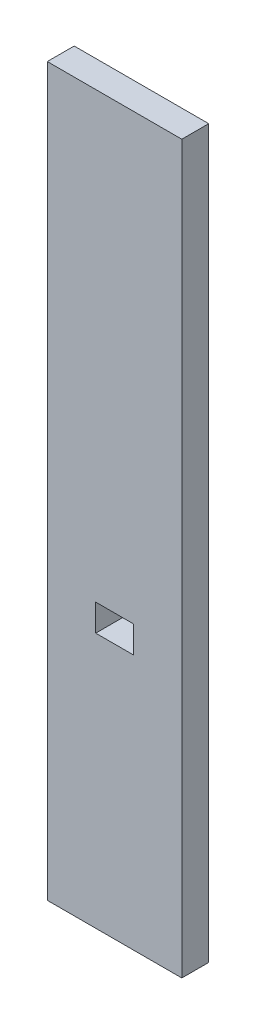
ISO-10303-21;
HEADER;
FILE_DESCRIPTION(('STEP AP214'),'2;1');
FILE_NAME('part.step','',(''),(''),'','','');
FILE_SCHEMA(('AUTOMOTIVE_DESIGN { 1 0 10303 214 1 1 1 1 }'));
ENDSEC;
DATA;
#1=APPLICATION_CONTEXT('core data for automotive mechanical design processes');
#2=APPLICATION_PROTOCOL_DEFINITION('international standard','automotive_design',2000,#1);
#3=PRODUCT_CONTEXT('',#1,'mechanical');
#4=PRODUCT('Part','Part','',(#3));
#5=PRODUCT_RELATED_PRODUCT_CATEGORY('part','',(#4));
#6=PRODUCT_DEFINITION_FORMATION('','',#4);
#7=PRODUCT_DEFINITION_CONTEXT('part definition',#1,'design');
#8=PRODUCT_DEFINITION('design','',#6,#7);
#9=PRODUCT_DEFINITION_SHAPE('','',#8);
#10=(LENGTH_UNIT() NAMED_UNIT(*) SI_UNIT(.MILLI.,.METRE.));
#11=(NAMED_UNIT(*) PLANE_ANGLE_UNIT() SI_UNIT($,.RADIAN.));
#12=(NAMED_UNIT(*) SI_UNIT($,.STERADIAN.) SOLID_ANGLE_UNIT());
#13=UNCERTAINTY_MEASURE_WITH_UNIT(LENGTH_MEASURE(1.E-05),#10,'distance_accuracy_value','');
#14=(GEOMETRIC_REPRESENTATION_CONTEXT(3) GLOBAL_UNCERTAINTY_ASSIGNED_CONTEXT((#13)) GLOBAL_UNIT_ASSIGNED_CONTEXT((#10,
#11,#12)) REPRESENTATION_CONTEXT('',''));
#15=CARTESIAN_POINT('',(0.,0.,0.));
#16=DIRECTION('',(0.,0.,1.));
#17=DIRECTION('',(1.,0.,0.));
#18=AXIS2_PLACEMENT_3D('',#15,#16,#17);
#19=CARTESIAN_POINT('',(-25.,135.,10.));
#20=DIRECTION('',(1.,0.,0.));
#21=DIRECTION('',(0.,1.,0.));
#22=AXIS2_PLACEMENT_3D('',#19,#20,#21);
#23=PLANE('',#22);
#24=DIRECTION('',(0.,-1.,0.));
#25=VECTOR('',#24,1.);
#26=CARTESIAN_POINT('',(-25.,135.,0.));
#27=LINE('',#26,#25);
#28=CARTESIAN_POINT('',(-25.,135.,0.));
#29=VERTEX_POINT('',#28);
#30=CARTESIAN_POINT('',(-25.,-135.,0.));
#31=VERTEX_POINT('',#30);
#32=EDGE_CURVE('E130',#29,#31,#27,.T.);
#33=ORIENTED_EDGE('',*,*,#32,.T.);
#34=DIRECTION('',(0.,0.,-1.));
#35=VECTOR('',#34,1.);
#36=CARTESIAN_POINT('',(-25.,-135.,10.));
#37=LINE('',#36,#35);
#38=CARTESIAN_POINT('',(-25.,-135.,10.));
#39=VERTEX_POINT('',#38);
#40=EDGE_CURVE('E11',#39,#31,#37,.T.);
#41=ORIENTED_EDGE('',*,*,#40,.F.);
#42=DIRECTION('',(0.,-1.,0.));
#43=VECTOR('',#42,1.);
#44=CARTESIAN_POINT('',(-25.,135.,10.));
#45=LINE('',#44,#43);
#46=CARTESIAN_POINT('',(-25.,135.,10.));
#47=VERTEX_POINT('',#46);
#48=EDGE_CURVE('E134',#47,#39,#45,.T.);
#49=ORIENTED_EDGE('',*,*,#48,.F.);
#50=DIRECTION('',(0.,0.,-1.));
#51=VECTOR('',#50,1.);
#52=CARTESIAN_POINT('',(-25.,135.,10.));
#53=LINE('',#52,#51);
#54=EDGE_CURVE('E144',#47,#29,#53,.T.);
#55=ORIENTED_EDGE('',*,*,#54,.T.);
#56=EDGE_LOOP('',(#33,#41,#49,#55));
#57=FACE_BOUND('',#56,.T.);
#58=ADVANCED_FACE('F33',(#57),#23,.F.);
#59=CARTESIAN_POINT('',(-25.,-135.,10.));
#60=DIRECTION('',(0.,1.,0.));
#61=DIRECTION('',(0.,0.,1.));
#62=AXIS2_PLACEMENT_3D('',#59,#60,#61);
#63=PLANE('',#62);
#64=DIRECTION('',(1.,0.,0.));
#65=VECTOR('',#64,1.);
#66=CARTESIAN_POINT('',(-25.,-135.,0.));
#67=LINE('',#66,#65);
#68=CARTESIAN_POINT('',(25.,-135.,0.));
#69=VERTEX_POINT('',#68);
#70=EDGE_CURVE('E147',#31,#69,#67,.T.);
#71=ORIENTED_EDGE('',*,*,#70,.T.);
#72=DIRECTION('',(0.,0.,-1.));
#73=VECTOR('',#72,1.);
#74=CARTESIAN_POINT('',(25.,-135.,10.));
#75=LINE('',#74,#73);
#76=CARTESIAN_POINT('',(25.,-135.,10.));
#77=VERTEX_POINT('',#76);
#78=EDGE_CURVE('E40',#77,#69,#75,.T.);
#79=ORIENTED_EDGE('',*,*,#78,.F.);
#80=DIRECTION('',(1.,0.,0.));
#81=VECTOR('',#80,1.);
#82=CARTESIAN_POINT('',(-25.,-135.,10.));
#83=LINE('',#82,#81);
#84=EDGE_CURVE('E137',#39,#77,#83,.T.);
#85=ORIENTED_EDGE('',*,*,#84,.F.);
#86=ORIENTED_EDGE('',*,*,#40,.T.);
#87=EDGE_LOOP('',(#71,#79,#85,#86));
#88=FACE_BOUND('',#87,.T.);
#89=ADVANCED_FACE('F175',(#88),#63,.F.);
#90=CARTESIAN_POINT('',(25.,135.,10.));
#91=DIRECTION('',(-1.,0.,0.));
#92=DIRECTION('',(0.,-1.,0.));
#93=AXIS2_PLACEMENT_3D('',#90,#91,#92);
#94=PLANE('',#93);
#95=DIRECTION('',(0.,1.,0.));
#96=VECTOR('',#95,1.);
#97=CARTESIAN_POINT('',(25.,135.,0.));
#98=LINE('',#97,#96);
#99=CARTESIAN_POINT('',(25.,135.,0.));
#100=VERTEX_POINT('',#99);
#101=EDGE_CURVE('E149',#69,#100,#98,.T.);
#102=ORIENTED_EDGE('',*,*,#101,.T.);
#103=DIRECTION('',(0.,0.,-1.));
#104=VECTOR('',#103,1.);
#105=CARTESIAN_POINT('',(25.,135.,10.));
#106=LINE('',#105,#104);
#107=CARTESIAN_POINT('',(25.,135.,10.));
#108=VERTEX_POINT('',#107);
#109=EDGE_CURVE('E154',#108,#100,#106,.T.);
#110=ORIENTED_EDGE('',*,*,#109,.F.);
#111=DIRECTION('',(0.,1.,0.));
#112=VECTOR('',#111,1.);
#113=CARTESIAN_POINT('',(25.,135.,10.));
#114=LINE('',#113,#112);
#115=EDGE_CURVE('E140',#77,#108,#114,.T.);
#116=ORIENTED_EDGE('',*,*,#115,.F.);
#117=ORIENTED_EDGE('',*,*,#78,.T.);
#118=EDGE_LOOP('',(#102,#110,#116,#117));
#119=FACE_BOUND('',#118,.T.);
#120=ADVANCED_FACE('F161',(#119),#94,.F.);
#121=CARTESIAN_POINT('',(-25.,135.,10.));
#122=DIRECTION('',(0.,-1.,0.));
#123=DIRECTION('',(0.,0.,-1.));
#124=AXIS2_PLACEMENT_3D('',#121,#122,#123);
#125=PLANE('',#124);
#126=DIRECTION('',(-1.,0.,0.));
#127=VECTOR('',#126,1.);
#128=CARTESIAN_POINT('',(-25.,135.,0.));
#129=LINE('',#128,#127);
#130=EDGE_CURVE('E138',#100,#29,#129,.T.);
#131=ORIENTED_EDGE('',*,*,#130,.T.);
#132=ORIENTED_EDGE('',*,*,#54,.F.);
#133=DIRECTION('',(-1.,0.,0.));
#134=VECTOR('',#133,1.);
#135=CARTESIAN_POINT('',(-25.,135.,10.));
#136=LINE('',#135,#134);
#137=EDGE_CURVE('E142',#108,#47,#136,.T.);
#138=ORIENTED_EDGE('',*,*,#137,.F.);
#139=ORIENTED_EDGE('',*,*,#109,.T.);
#140=EDGE_LOOP('',(#131,#132,#138,#139));
#141=FACE_BOUND('',#140,.T.);
#142=ADVANCED_FACE('F168',(#141),#125,.F.);
#143=CARTESIAN_POINT('',(0.,0.,10.));
#144=DIRECTION('',(0.,0.,1.));
#145=DIRECTION('',(1.,0.,0.));
#146=AXIS2_PLACEMENT_3D('',#143,#144,#145);
#147=PLANE('',#146);
#148=DIRECTION('',(0.,-1.,0.));
#149=VECTOR('',#148,1.);
#150=CARTESIAN_POINT('',(-7.,-30.,10.));
#151=LINE('',#150,#149);
#152=CARTESIAN_POINT('',(-7.,-30.,10.));
#153=VERTEX_POINT('',#152);
#154=CARTESIAN_POINT('',(-7.,-40.,10.));
#155=VERTEX_POINT('',#154);
#156=EDGE_CURVE('E47',#153,#155,#151,.T.);
#157=ORIENTED_EDGE('',*,*,#156,.F.);
#158=DIRECTION('',(-1.,0.,0.));
#159=VECTOR('',#158,1.);
#160=CARTESIAN_POINT('',(-7.,-30.,10.));
#161=LINE('',#160,#159);
#162=CARTESIAN_POINT('',(7.,-30.,10.));
#163=VERTEX_POINT('',#162);
#164=EDGE_CURVE('E115',#163,#153,#161,.T.);
#165=ORIENTED_EDGE('',*,*,#164,.F.);
#166=DIRECTION('',(0.,1.,0.));
#167=VECTOR('',#166,1.);
#168=CARTESIAN_POINT('',(7.,-30.,10.));
#169=LINE('',#168,#167);
#170=CARTESIAN_POINT('',(7.,-40.,10.));
#171=VERTEX_POINT('',#170);
#172=EDGE_CURVE('E118',#171,#163,#169,.T.);
#173=ORIENTED_EDGE('',*,*,#172,.F.);
#174=DIRECTION('',(1.,0.,0.));
#175=VECTOR('',#174,1.);
#176=CARTESIAN_POINT('',(-7.,-40.,10.));
#177=LINE('',#176,#175);
#178=EDGE_CURVE('E124',#155,#171,#177,.T.);
#179=ORIENTED_EDGE('',*,*,#178,.F.);
#180=EDGE_LOOP('',(#157,#165,#173,#179));
#181=FACE_BOUND('',#180,.T.);
#182=ORIENTED_EDGE('',*,*,#48,.T.);
#183=ORIENTED_EDGE('',*,*,#84,.T.);
#184=ORIENTED_EDGE('',*,*,#115,.T.);
#185=ORIENTED_EDGE('',*,*,#137,.T.);
#186=EDGE_LOOP('',(#182,#183,#184,#185));
#187=FACE_BOUND('',#186,.T.);
#188=ADVANCED_FACE('F174',(#181,#187),#147,.T.);
#189=CARTESIAN_POINT('',(0.,0.,0.));
#190=DIRECTION('',(0.,0.,1.));
#191=DIRECTION('',(1.,0.,0.));
#192=AXIS2_PLACEMENT_3D('',#189,#190,#191);
#193=PLANE('',#192);
#194=DIRECTION('',(-1.,0.,0.));
#195=VECTOR('',#194,1.);
#196=CARTESIAN_POINT('',(-7.,-30.,0.));
#197=LINE('',#196,#195);
#198=CARTESIAN_POINT('',(7.,-30.,0.));
#199=VERTEX_POINT('',#198);
#200=CARTESIAN_POINT('',(-7.,-30.,0.));
#201=VERTEX_POINT('',#200);
#202=EDGE_CURVE('E105',#199,#201,#197,.T.);
#203=ORIENTED_EDGE('',*,*,#202,.T.);
#204=DIRECTION('',(0.,-1.,0.));
#205=VECTOR('',#204,1.);
#206=CARTESIAN_POINT('',(-7.,-30.,0.));
#207=LINE('',#206,#205);
#208=CARTESIAN_POINT('',(-7.,-40.,0.));
#209=VERTEX_POINT('',#208);
#210=EDGE_CURVE('E99',#201,#209,#207,.T.);
#211=ORIENTED_EDGE('',*,*,#210,.T.);
#212=DIRECTION('',(1.,0.,0.));
#213=VECTOR('',#212,1.);
#214=CARTESIAN_POINT('',(-7.,-40.,0.));
#215=LINE('',#214,#213);
#216=CARTESIAN_POINT('',(7.,-40.,0.));
#217=VERTEX_POINT('',#216);
#218=EDGE_CURVE('E108',#209,#217,#215,.T.);
#219=ORIENTED_EDGE('',*,*,#218,.T.);
#220=DIRECTION('',(0.,1.,0.));
#221=VECTOR('',#220,1.);
#222=CARTESIAN_POINT('',(7.,-30.,0.));
#223=LINE('',#222,#221);
#224=EDGE_CURVE('E55',#217,#199,#223,.T.);
#225=ORIENTED_EDGE('',*,*,#224,.T.);
#226=EDGE_LOOP('',(#203,#211,#219,#225));
#227=FACE_BOUND('',#226,.T.);
#228=ORIENTED_EDGE('',*,*,#32,.F.);
#229=ORIENTED_EDGE('',*,*,#130,.F.);
#230=ORIENTED_EDGE('',*,*,#101,.F.);
#231=ORIENTED_EDGE('',*,*,#70,.F.);
#232=EDGE_LOOP('',(#228,#229,#230,#231));
#233=FACE_BOUND('',#232,.T.);
#234=ADVANCED_FACE('F112',(#227,#233),#193,.F.);
#235=CARTESIAN_POINT('',(-7.,-30.,0.));
#236=DIRECTION('',(-1.,0.,0.));
#237=DIRECTION('',(0.,0.,1.));
#238=AXIS2_PLACEMENT_3D('',#235,#236,#237);
#239=PLANE('',#238);
#240=ORIENTED_EDGE('',*,*,#156,.T.);
#241=DIRECTION('',(0.,0.,1.));
#242=VECTOR('',#241,1.);
#243=CARTESIAN_POINT('',(-7.,-40.,0.));
#244=LINE('',#243,#242);
#245=EDGE_CURVE('E95',#209,#155,#244,.T.);
#246=ORIENTED_EDGE('',*,*,#245,.F.);
#247=ORIENTED_EDGE('',*,*,#210,.F.);
#248=DIRECTION('',(0.,0.,1.));
#249=VECTOR('',#248,1.);
#250=CARTESIAN_POINT('',(-7.,-30.,0.));
#251=LINE('',#250,#249);
#252=EDGE_CURVE('E128',#201,#153,#251,.T.);
#253=ORIENTED_EDGE('',*,*,#252,.T.);
#254=EDGE_LOOP('',(#240,#246,#247,#253));
#255=FACE_BOUND('',#254,.T.);
#256=ADVANCED_FACE('F97',(#255),#239,.F.);
#257=CARTESIAN_POINT('',(-7.,-30.,0.));
#258=DIRECTION('',(0.,1.,0.));
#259=DIRECTION('',(0.,0.,1.));
#260=AXIS2_PLACEMENT_3D('',#257,#258,#259);
#261=PLANE('',#260);
#262=ORIENTED_EDGE('',*,*,#164,.T.);
#263=ORIENTED_EDGE('',*,*,#252,.F.);
#264=ORIENTED_EDGE('',*,*,#202,.F.);
#265=DIRECTION('',(0.,0.,1.));
#266=VECTOR('',#265,1.);
#267=CARTESIAN_POINT('',(7.,-30.,0.));
#268=LINE('',#267,#266);
#269=EDGE_CURVE('E131',#199,#163,#268,.T.);
#270=ORIENTED_EDGE('',*,*,#269,.T.);
#271=EDGE_LOOP('',(#262,#263,#264,#270));
#272=FACE_BOUND('',#271,.T.);
#273=ADVANCED_FACE('F192',(#272),#261,.F.);
#274=CARTESIAN_POINT('',(7.,-30.,0.));
#275=DIRECTION('',(1.,0.,0.));
#276=DIRECTION('',(0.,0.,-1.));
#277=AXIS2_PLACEMENT_3D('',#274,#275,#276);
#278=PLANE('',#277);
#279=ORIENTED_EDGE('',*,*,#172,.T.);
#280=ORIENTED_EDGE('',*,*,#269,.F.);
#281=ORIENTED_EDGE('',*,*,#224,.F.);
#282=DIRECTION('',(0.,0.,1.));
#283=VECTOR('',#282,1.);
#284=CARTESIAN_POINT('',(7.,-40.,0.));
#285=LINE('',#284,#283);
#286=EDGE_CURVE('E104',#217,#171,#285,.T.);
#287=ORIENTED_EDGE('',*,*,#286,.T.);
#288=EDGE_LOOP('',(#279,#280,#281,#287));
#289=FACE_BOUND('',#288,.T.);
#290=ADVANCED_FACE('F195',(#289),#278,.F.);
#291=CARTESIAN_POINT('',(-7.,-40.,0.));
#292=DIRECTION('',(0.,-1.,0.));
#293=DIRECTION('',(0.,0.,-1.));
#294=AXIS2_PLACEMENT_3D('',#291,#292,#293);
#295=PLANE('',#294);
#296=ORIENTED_EDGE('',*,*,#178,.T.);
#297=ORIENTED_EDGE('',*,*,#286,.F.);
#298=ORIENTED_EDGE('',*,*,#218,.F.);
#299=ORIENTED_EDGE('',*,*,#245,.T.);
#300=EDGE_LOOP('',(#296,#297,#298,#299));
#301=FACE_BOUND('',#300,.T.);
#302=ADVANCED_FACE('F109',(#301),#295,.F.);
#303=CLOSED_SHELL('',(#58,#89,#120,#142,#188,#234,#256,#273,#290,#302));
#304=MANIFOLD_SOLID_BREP('B2',#303);
#305=ADVANCED_BREP_SHAPE_REPRESENTATION('',(#18,#304),#14);
#306=SHAPE_DEFINITION_REPRESENTATION(#9,#305);
ENDSEC;
END-ISO-10303-21;
